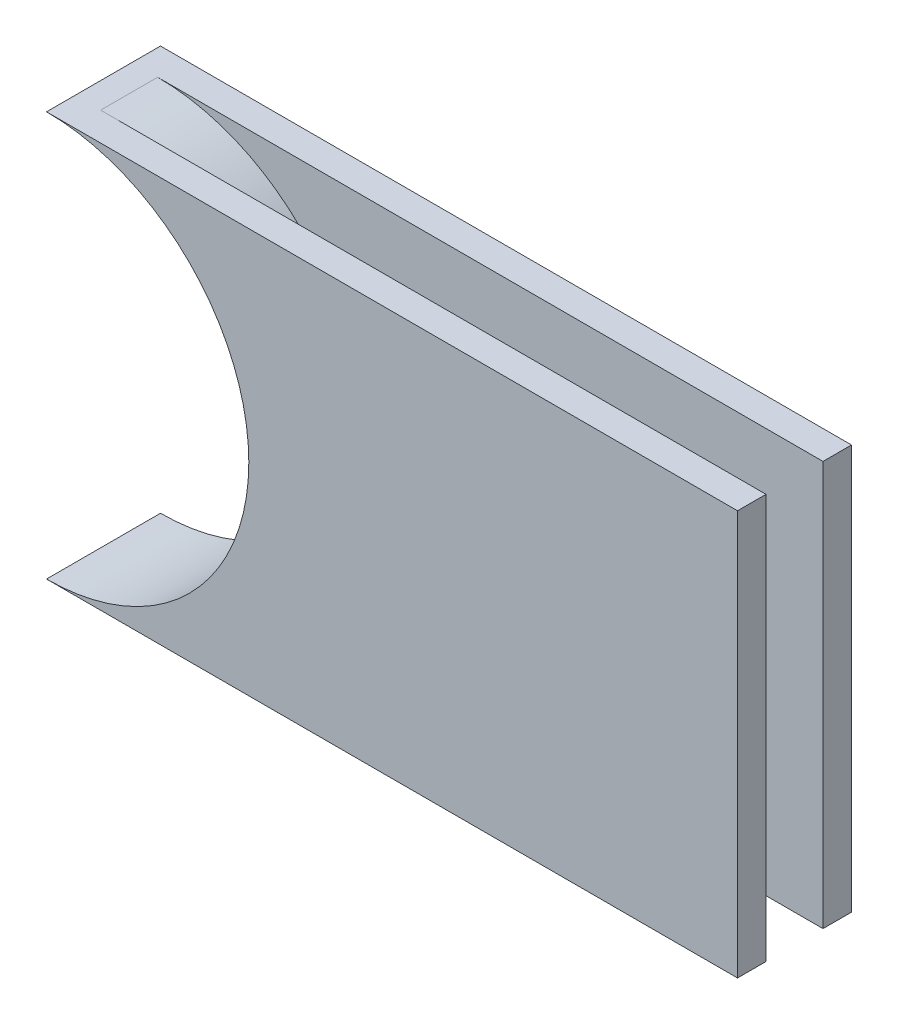
ISO-10303-21;
HEADER;
FILE_DESCRIPTION(('STEP AP214'),'2;1');
FILE_NAME('part.step','',(''),(''),'','','');
FILE_SCHEMA(('AUTOMOTIVE_DESIGN { 1 0 10303 214 1 1 1 1 }'));
ENDSEC;
DATA;
#1=APPLICATION_CONTEXT('core data for automotive mechanical design processes');
#2=APPLICATION_PROTOCOL_DEFINITION('international standard','automotive_design',2000,#1);
#3=PRODUCT_CONTEXT('',#1,'mechanical');
#4=PRODUCT('Part','Part','',(#3));
#5=PRODUCT_RELATED_PRODUCT_CATEGORY('part','',(#4));
#6=PRODUCT_DEFINITION_FORMATION('','',#4);
#7=PRODUCT_DEFINITION_CONTEXT('part definition',#1,'design');
#8=PRODUCT_DEFINITION('design','',#6,#7);
#9=PRODUCT_DEFINITION_SHAPE('','',#8);
#10=(LENGTH_UNIT() NAMED_UNIT(*) SI_UNIT(.MILLI.,.METRE.));
#11=(NAMED_UNIT(*) PLANE_ANGLE_UNIT() SI_UNIT($,.RADIAN.));
#12=(NAMED_UNIT(*) SI_UNIT($,.STERADIAN.) SOLID_ANGLE_UNIT());
#13=UNCERTAINTY_MEASURE_WITH_UNIT(LENGTH_MEASURE(1.E-05),#10,'distance_accuracy_value','');
#14=(GEOMETRIC_REPRESENTATION_CONTEXT(3) GLOBAL_UNCERTAINTY_ASSIGNED_CONTEXT((#13)) GLOBAL_UNIT_ASSIGNED_CONTEXT((#10,
#11,#12)) REPRESENTATION_CONTEXT('',''));
#15=CARTESIAN_POINT('',(0.,0.,0.));
#16=DIRECTION('',(0.,0.,1.));
#17=DIRECTION('',(1.,0.,0.));
#18=AXIS2_PLACEMENT_3D('',#15,#16,#17);
#19=CARTESIAN_POINT('',(0.,18.034,0.));
#20=DIRECTION('',(0.,1.,0.));
#21=DIRECTION('',(0.,0.,1.));
#22=AXIS2_PLACEMENT_3D('',#19,#20,#21);
#23=PLANE('',#22);
#24=DIRECTION('',(-1.,0.,0.));
#25=VECTOR('',#24,1.);
#26=CARTESIAN_POINT('',(61.595,18.034,5.08));
#27=LINE('',#26,#25);
#28=CARTESIAN_POINT('',(61.595,18.034,5.08));
#29=VERTEX_POINT('',#28);
#30=CARTESIAN_POINT('',(2.286,18.034,5.08));
#31=VERTEX_POINT('',#30);
#32=EDGE_CURVE('E132',#29,#31,#27,.T.);
#33=ORIENTED_EDGE('',*,*,#32,.T.);
#34=DIRECTION('',(0.,0.,-1.));
#35=VECTOR('',#34,1.);
#36=CARTESIAN_POINT('',(2.286,18.034,5.08));
#37=LINE('',#36,#35);
#38=CARTESIAN_POINT('',(2.286,18.034,0.));
#39=VERTEX_POINT('',#38);
#40=EDGE_CURVE('E119',#31,#39,#37,.T.);
#41=ORIENTED_EDGE('',*,*,#40,.T.);
#42=DIRECTION('',(-1.,0.,0.));
#43=VECTOR('',#42,1.);
#44=CARTESIAN_POINT('',(61.595,18.034,0.));
#45=LINE('',#44,#43);
#46=CARTESIAN_POINT('',(61.595,18.034,0.));
#47=VERTEX_POINT('',#46);
#48=EDGE_CURVE('E134',#47,#39,#45,.T.);
#49=ORIENTED_EDGE('',*,*,#48,.F.);
#50=DIRECTION('',(0.,0.,1.));
#51=VECTOR('',#50,1.);
#52=CARTESIAN_POINT('',(61.595,18.034,0.));
#53=LINE('',#52,#51);
#54=CARTESIAN_POINT('',(61.595,18.034,-2.54));
#55=VERTEX_POINT('',#54);
#56=EDGE_CURVE('E157',#55,#47,#53,.T.);
#57=ORIENTED_EDGE('',*,*,#56,.F.);
#58=DIRECTION('',(1.,0.,0.));
#59=VECTOR('',#58,1.);
#60=CARTESIAN_POINT('',(0.,18.034,-2.54));
#61=LINE('',#60,#59);
#62=CARTESIAN_POINT('',(0.,18.034,-2.54));
#63=VERTEX_POINT('',#62);
#64=EDGE_CURVE('E139',#63,#55,#61,.T.);
#65=ORIENTED_EDGE('',*,*,#64,.F.);
#66=DIRECTION('',(0.,0.,1.));
#67=VECTOR('',#66,1.);
#68=CARTESIAN_POINT('',(0.,18.034,0.));
#69=LINE('',#68,#67);
#70=CARTESIAN_POINT('',(0.,18.034,7.62));
#71=VERTEX_POINT('',#70);
#72=EDGE_CURVE('E43',#63,#71,#69,.T.);
#73=ORIENTED_EDGE('',*,*,#72,.T.);
#74=DIRECTION('',(-1.,0.,0.));
#75=VECTOR('',#74,1.);
#76=CARTESIAN_POINT('',(0.,18.034,7.62));
#77=LINE('',#76,#75);
#78=CARTESIAN_POINT('',(61.595,18.034,7.62));
#79=VERTEX_POINT('',#78);
#80=EDGE_CURVE('E154',#79,#71,#77,.T.);
#81=ORIENTED_EDGE('',*,*,#80,.F.);
#82=EDGE_CURVE('E160',#29,#79,#53,.T.);
#83=ORIENTED_EDGE('',*,*,#82,.F.);
#84=EDGE_LOOP('',(#33,#41,#49,#57,#65,#73,#81,#83));
#85=FACE_BOUND('',#84,.T.);
#86=ADVANCED_FACE('F35',(#85),#23,.T.);
#87=CARTESIAN_POINT('',(61.595,18.034,0.));
#88=DIRECTION('',(1.,0.,0.));
#89=DIRECTION('',(0.,1.,0.));
#90=AXIS2_PLACEMENT_3D('',#87,#88,#89);
#91=PLANE('',#90);
#92=DIRECTION('',(0.,0.,1.));
#93=VECTOR('',#92,1.);
#94=CARTESIAN_POINT('',(61.595,-18.034,0.));
#95=LINE('',#94,#93);
#96=CARTESIAN_POINT('',(61.595,-18.034,5.08));
#97=VERTEX_POINT('',#96);
#98=CARTESIAN_POINT('',(61.595,-18.034,7.62));
#99=VERTEX_POINT('',#98);
#100=EDGE_CURVE('E162',#97,#99,#95,.T.);
#101=ORIENTED_EDGE('',*,*,#100,.F.);
#102=DIRECTION('',(0.,-1.,0.));
#103=VECTOR('',#102,1.);
#104=CARTESIAN_POINT('',(61.595,-18.034,5.08));
#105=LINE('',#104,#103);
#106=EDGE_CURVE('E106',#29,#97,#105,.T.);
#107=ORIENTED_EDGE('',*,*,#106,.F.);
#108=ORIENTED_EDGE('',*,*,#82,.T.);
#109=DIRECTION('',(0.,1.,0.));
#110=VECTOR('',#109,1.);
#111=CARTESIAN_POINT('',(61.595,18.034,7.62));
#112=LINE('',#111,#110);
#113=EDGE_CURVE('E151',#99,#79,#112,.T.);
#114=ORIENTED_EDGE('',*,*,#113,.F.);
#115=EDGE_LOOP('',(#101,#107,#108,#114));
#116=FACE_BOUND('',#115,.T.);
#117=ADVANCED_FACE('F166',(#116),#91,.T.);
#118=ORIENTED_EDGE('',*,*,#56,.T.);
#119=DIRECTION('',(0.,1.,0.));
#120=VECTOR('',#119,1.);
#121=CARTESIAN_POINT('',(61.595,-18.034,0.));
#122=LINE('',#121,#120);
#123=CARTESIAN_POINT('',(61.595,-18.034,0.));
#124=VERTEX_POINT('',#123);
#125=EDGE_CURVE('E126',#124,#47,#122,.T.);
#126=ORIENTED_EDGE('',*,*,#125,.F.);
#127=CARTESIAN_POINT('',(61.595,-18.034,-2.54));
#128=VERTEX_POINT('',#127);
#129=EDGE_CURVE('E161',#128,#124,#95,.T.);
#130=ORIENTED_EDGE('',*,*,#129,.F.);
#131=DIRECTION('',(0.,-1.,0.));
#132=VECTOR('',#131,1.);
#133=CARTESIAN_POINT('',(61.595,18.034,-2.54));
#134=LINE('',#133,#132);
#135=EDGE_CURVE('E142',#55,#128,#134,.T.);
#136=ORIENTED_EDGE('',*,*,#135,.F.);
#137=EDGE_LOOP('',(#118,#126,#130,#136));
#138=FACE_BOUND('',#137,.T.);
#139=ADVANCED_FACE('F177',(#138),#91,.T.);
#140=CARTESIAN_POINT('',(0.,-18.034,0.));
#141=DIRECTION('',(0.,-1.,0.));
#142=DIRECTION('',(0.,0.,-1.));
#143=AXIS2_PLACEMENT_3D('',#140,#141,#142);
#144=PLANE('',#143);
#145=DIRECTION('',(0.,0.,-1.));
#146=VECTOR('',#145,1.);
#147=CARTESIAN_POINT('',(2.286,-18.034,5.08));
#148=LINE('',#147,#146);
#149=CARTESIAN_POINT('',(2.286,-18.034,5.08));
#150=VERTEX_POINT('',#149);
#151=CARTESIAN_POINT('',(2.286,-18.034,0.));
#152=VERTEX_POINT('',#151);
#153=EDGE_CURVE('E117',#150,#152,#148,.T.);
#154=ORIENTED_EDGE('',*,*,#153,.F.);
#155=DIRECTION('',(-1.,0.,0.));
#156=VECTOR('',#155,1.);
#157=CARTESIAN_POINT('',(61.595,-18.034,5.08));
#158=LINE('',#157,#156);
#159=EDGE_CURVE('E100',#97,#150,#158,.T.);
#160=ORIENTED_EDGE('',*,*,#159,.F.);
#161=ORIENTED_EDGE('',*,*,#100,.T.);
#162=DIRECTION('',(1.,0.,0.));
#163=VECTOR('',#162,1.);
#164=CARTESIAN_POINT('',(0.,-18.034,7.62));
#165=LINE('',#164,#163);
#166=CARTESIAN_POINT('',(0.,-18.034,7.62));
#167=VERTEX_POINT('',#166);
#168=EDGE_CURVE('E148',#167,#99,#165,.T.);
#169=ORIENTED_EDGE('',*,*,#168,.F.);
#170=DIRECTION('',(0.,0.,1.));
#171=VECTOR('',#170,1.);
#172=CARTESIAN_POINT('',(0.,-18.034,0.));
#173=LINE('',#172,#171);
#174=CARTESIAN_POINT('',(0.,-18.034,-2.54));
#175=VERTEX_POINT('',#174);
#176=EDGE_CURVE('E49',#175,#167,#173,.T.);
#177=ORIENTED_EDGE('',*,*,#176,.F.);
#178=DIRECTION('',(-1.,0.,0.));
#179=VECTOR('',#178,1.);
#180=CARTESIAN_POINT('',(61.595,-18.034,-2.54));
#181=LINE('',#180,#179);
#182=EDGE_CURVE('E145',#128,#175,#181,.T.);
#183=ORIENTED_EDGE('',*,*,#182,.F.);
#184=ORIENTED_EDGE('',*,*,#129,.T.);
#185=DIRECTION('',(-1.,0.,0.));
#186=VECTOR('',#185,1.);
#187=CARTESIAN_POINT('',(61.595,-18.034,0.));
#188=LINE('',#187,#186);
#189=EDGE_CURVE('E111',#124,#152,#188,.T.);
#190=ORIENTED_EDGE('',*,*,#189,.T.);
#191=EDGE_LOOP('',(#154,#160,#161,#169,#177,#183,#184,#190));
#192=FACE_BOUND('',#191,.T.);
#193=ADVANCED_FACE('F122',(#192),#144,.T.);
#194=CARTESIAN_POINT('',(0.,0.,7.62));
#195=DIRECTION('',(0.,0.,1.));
#196=DIRECTION('',(1.,0.,0.));
#197=AXIS2_PLACEMENT_3D('',#194,#195,#196);
#198=PLANE('',#197);
#199=ORIENTED_EDGE('',*,*,#113,.T.);
#200=ORIENTED_EDGE('',*,*,#80,.T.);
#201=CARTESIAN_POINT('',(0.,0.,7.62));
#202=DIRECTION('',(0.,0.,1.));
#203=DIRECTION('',(1.,0.,0.));
#204=AXIS2_PLACEMENT_3D('',#201,#202,#203);
#205=CIRCLE('',#204,18.034);
#206=EDGE_CURVE('E12',#167,#71,#205,.T.);
#207=ORIENTED_EDGE('',*,*,#206,.F.);
#208=ORIENTED_EDGE('',*,*,#168,.T.);
#209=EDGE_LOOP('',(#199,#200,#207,#208));
#210=FACE_BOUND('',#209,.T.);
#211=ADVANCED_FACE('F37',(#210),#198,.T.);
#212=CARTESIAN_POINT('',(0.,0.,0.));
#213=DIRECTION('',(0.,0.,1.));
#214=DIRECTION('',(1.,0.,0.));
#215=AXIS2_PLACEMENT_3D('',#212,#213,#214);
#216=CYLINDRICAL_SURFACE('',#215,18.034);
#217=ORIENTED_EDGE('',*,*,#206,.T.);
#218=ORIENTED_EDGE('',*,*,#72,.F.);
#219=CARTESIAN_POINT('',(0.,0.,-2.54));
#220=DIRECTION('',(0.,0.,1.));
#221=DIRECTION('',(-1.,0.,0.));
#222=AXIS2_PLACEMENT_3D('',#219,#220,#221);
#223=CIRCLE('',#222,18.034);
#224=EDGE_CURVE('E110',#175,#63,#223,.T.);
#225=ORIENTED_EDGE('',*,*,#224,.F.);
#226=ORIENTED_EDGE('',*,*,#176,.T.);
#227=EDGE_LOOP('',(#217,#218,#225,#226));
#228=FACE_BOUND('',#227,.T.);
#229=ADVANCED_FACE('F169',(#228),#216,.F.);
#230=CARTESIAN_POINT('',(0.,0.,-2.54));
#231=DIRECTION('',(0.,0.,-1.));
#232=DIRECTION('',(-1.,0.,0.));
#233=AXIS2_PLACEMENT_3D('',#230,#231,#232);
#234=PLANE('',#233);
#235=ORIENTED_EDGE('',*,*,#224,.T.);
#236=ORIENTED_EDGE('',*,*,#64,.T.);
#237=ORIENTED_EDGE('',*,*,#135,.T.);
#238=ORIENTED_EDGE('',*,*,#182,.T.);
#239=EDGE_LOOP('',(#235,#236,#237,#238));
#240=FACE_BOUND('',#239,.T.);
#241=ADVANCED_FACE('F173',(#240),#234,.T.);
#242=CARTESIAN_POINT('',(61.595,-18.034,5.08));
#243=DIRECTION('',(0.,0.,-1.));
#244=DIRECTION('',(-1.,0.,0.));
#245=AXIS2_PLACEMENT_3D('',#242,#243,#244);
#246=PLANE('',#245);
#247=ORIENTED_EDGE('',*,*,#159,.T.);
#248=CARTESIAN_POINT('',(2.286,0.,5.08));
#249=DIRECTION('',(0.,0.,1.));
#250=DIRECTION('',(1.,0.,0.));
#251=AXIS2_PLACEMENT_3D('',#248,#249,#250);
#252=CIRCLE('',#251,18.034);
#253=EDGE_CURVE('E103',#150,#31,#252,.T.);
#254=ORIENTED_EDGE('',*,*,#253,.T.);
#255=ORIENTED_EDGE('',*,*,#32,.F.);
#256=ORIENTED_EDGE('',*,*,#106,.T.);
#257=EDGE_LOOP('',(#247,#254,#255,#256));
#258=FACE_BOUND('',#257,.T.);
#259=ADVANCED_FACE('F102',(#258),#246,.T.);
#260=CARTESIAN_POINT('',(61.595,-18.034,0.));
#261=DIRECTION('',(0.,0.,1.));
#262=DIRECTION('',(1.,0.,0.));
#263=AXIS2_PLACEMENT_3D('',#260,#261,#262);
#264=PLANE('',#263);
#265=ORIENTED_EDGE('',*,*,#48,.T.);
#266=CARTESIAN_POINT('',(2.286,0.,0.));
#267=DIRECTION('',(0.,0.,1.));
#268=DIRECTION('',(1.,0.,0.));
#269=AXIS2_PLACEMENT_3D('',#266,#267,#268);
#270=CIRCLE('',#269,18.034);
#271=EDGE_CURVE('E120',#152,#39,#270,.T.);
#272=ORIENTED_EDGE('',*,*,#271,.F.);
#273=ORIENTED_EDGE('',*,*,#189,.F.);
#274=ORIENTED_EDGE('',*,*,#125,.T.);
#275=EDGE_LOOP('',(#265,#272,#273,#274));
#276=FACE_BOUND('',#275,.T.);
#277=ADVANCED_FACE('F179',(#276),#264,.T.);
#278=CARTESIAN_POINT('',(2.286,0.,5.08));
#279=DIRECTION('',(0.,0.,-1.));
#280=DIRECTION('',(-1.,0.,0.));
#281=AXIS2_PLACEMENT_3D('',#278,#279,#280);
#282=CYLINDRICAL_SURFACE('',#281,18.034);
#283=ORIENTED_EDGE('',*,*,#271,.T.);
#284=ORIENTED_EDGE('',*,*,#40,.F.);
#285=ORIENTED_EDGE('',*,*,#253,.F.);
#286=ORIENTED_EDGE('',*,*,#153,.T.);
#287=EDGE_LOOP('',(#283,#284,#285,#286));
#288=FACE_BOUND('',#287,.T.);
#289=ADVANCED_FACE('F116',(#288),#282,.T.);
#290=CLOSED_SHELL('',(#86,#117,#139,#193,#211,#229,#241,#259,#277,#289));
#291=MANIFOLD_SOLID_BREP('B2',#290);
#292=ADVANCED_BREP_SHAPE_REPRESENTATION('',(#18,#291),#14);
#293=SHAPE_DEFINITION_REPRESENTATION(#9,#292);
ENDSEC;
END-ISO-10303-21;
